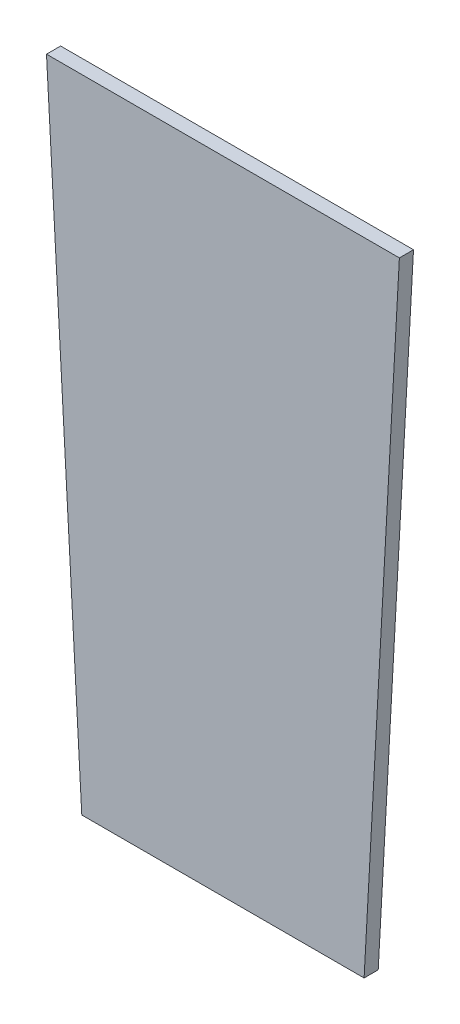
ISO-10303-21;
HEADER;
FILE_DESCRIPTION(('STEP AP214'),'2;1');
FILE_NAME('part.step','',(''),(''),'','','');
FILE_SCHEMA(('AUTOMOTIVE_DESIGN { 1 0 10303 214 1 1 1 1 }'));
ENDSEC;
DATA;
#1=APPLICATION_CONTEXT('core data for automotive mechanical design processes');
#2=APPLICATION_PROTOCOL_DEFINITION('international standard','automotive_design',2000,#1);
#3=PRODUCT_CONTEXT('',#1,'mechanical');
#4=PRODUCT('Part','Part','',(#3));
#5=PRODUCT_RELATED_PRODUCT_CATEGORY('part','',(#4));
#6=PRODUCT_DEFINITION_FORMATION('','',#4);
#7=PRODUCT_DEFINITION_CONTEXT('part definition',#1,'design');
#8=PRODUCT_DEFINITION('design','',#6,#7);
#9=PRODUCT_DEFINITION_SHAPE('','',#8);
#10=(LENGTH_UNIT() NAMED_UNIT(*) SI_UNIT(.MILLI.,.METRE.));
#11=(NAMED_UNIT(*) PLANE_ANGLE_UNIT() SI_UNIT($,.RADIAN.));
#12=(NAMED_UNIT(*) SI_UNIT($,.STERADIAN.) SOLID_ANGLE_UNIT());
#13=UNCERTAINTY_MEASURE_WITH_UNIT(LENGTH_MEASURE(1.E-05),#10,'distance_accuracy_value','');
#14=(GEOMETRIC_REPRESENTATION_CONTEXT(3) GLOBAL_UNCERTAINTY_ASSIGNED_CONTEXT((#13)) GLOBAL_UNIT_ASSIGNED_CONTEXT((#10,
#11,#12)) REPRESENTATION_CONTEXT('',''));
#15=CARTESIAN_POINT('',(0.,0.,0.));
#16=DIRECTION('',(0.,0.,1.));
#17=DIRECTION('',(1.,0.,0.));
#18=AXIS2_PLACEMENT_3D('',#15,#16,#17);
#19=CARTESIAN_POINT('',(-100.,-204.72972972973,10.));
#20=DIRECTION('',(0.998489379481367,0.0549450549450549,0.));
#21=DIRECTION('',(-0.0549450549450549,0.998489379481367,0.));
#22=AXIS2_PLACEMENT_3D('',#19,#20,#21);
#23=PLANE('',#22);
#24=DIRECTION('',(0.0549450549450549,-0.998489379481367,0.));
#25=VECTOR('',#24,1.);
#26=CARTESIAN_POINT('',(-100.,-204.72972972973,0.));
#27=LINE('',#26,#25);
#28=CARTESIAN_POINT('',(-125.,249.582937934292,0.));
#29=VERTEX_POINT('',#28);
#30=CARTESIAN_POINT('',(-100.,-204.72972972973,0.));
#31=VERTEX_POINT('',#30);
#32=EDGE_CURVE('E123',#29,#31,#27,.T.);
#33=ORIENTED_EDGE('',*,*,#32,.T.);
#34=DIRECTION('',(0.,0.,-1.));
#35=VECTOR('',#34,1.);
#36=CARTESIAN_POINT('',(-100.,-204.72972972973,10.));
#37=LINE('',#36,#35);
#38=CARTESIAN_POINT('',(-100.,-204.72972972973,10.));
#39=VERTEX_POINT('',#38);
#40=EDGE_CURVE('E11',#39,#31,#37,.T.);
#41=ORIENTED_EDGE('',*,*,#40,.F.);
#42=DIRECTION('',(0.0549450549450549,-0.998489379481367,0.));
#43=VECTOR('',#42,1.);
#44=CARTESIAN_POINT('',(-100.,-204.72972972973,10.));
#45=LINE('',#44,#43);
#46=CARTESIAN_POINT('',(-125.,249.582937934292,10.));
#47=VERTEX_POINT('',#46);
#48=EDGE_CURVE('E107',#47,#39,#45,.T.);
#49=ORIENTED_EDGE('',*,*,#48,.F.);
#50=DIRECTION('',(0.,0.,-1.));
#51=VECTOR('',#50,1.);
#52=CARTESIAN_POINT('',(-125.,249.582937934292,10.));
#53=LINE('',#52,#51);
#54=EDGE_CURVE('E119',#47,#29,#53,.T.);
#55=ORIENTED_EDGE('',*,*,#54,.T.);
#56=EDGE_LOOP('',(#33,#41,#49,#55));
#57=FACE_BOUND('',#56,.T.);
#58=ADVANCED_FACE('F49',(#57),#23,.F.);
#59=CARTESIAN_POINT('',(100.,-204.72972972973,10.));
#60=DIRECTION('',(0.,1.,0.));
#61=DIRECTION('',(0.,0.,1.));
#62=AXIS2_PLACEMENT_3D('',#59,#60,#61);
#63=PLANE('',#62);
#64=DIRECTION('',(1.,0.,0.));
#65=VECTOR('',#64,1.);
#66=CARTESIAN_POINT('',(100.,-204.72972972973,0.));
#67=LINE('',#66,#65);
#68=CARTESIAN_POINT('',(100.,-204.72972972973,0.));
#69=VERTEX_POINT('',#68);
#70=EDGE_CURVE('E112',#31,#69,#67,.T.);
#71=ORIENTED_EDGE('',*,*,#70,.T.);
#72=DIRECTION('',(0.,0.,-1.));
#73=VECTOR('',#72,1.);
#74=CARTESIAN_POINT('',(100.,-204.72972972973,10.));
#75=LINE('',#74,#73);
#76=CARTESIAN_POINT('',(100.,-204.72972972973,10.));
#77=VERTEX_POINT('',#76);
#78=EDGE_CURVE('E58',#77,#69,#75,.T.);
#79=ORIENTED_EDGE('',*,*,#78,.F.);
#80=DIRECTION('',(1.,0.,0.));
#81=VECTOR('',#80,1.);
#82=CARTESIAN_POINT('',(100.,-204.72972972973,10.));
#83=LINE('',#82,#81);
#84=EDGE_CURVE('E101',#39,#77,#83,.T.);
#85=ORIENTED_EDGE('',*,*,#84,.F.);
#86=ORIENTED_EDGE('',*,*,#40,.T.);
#87=EDGE_LOOP('',(#71,#79,#85,#86));
#88=FACE_BOUND('',#87,.T.);
#89=ADVANCED_FACE('F111',(#88),#63,.F.);
#90=CARTESIAN_POINT('',(125.,249.582937934292,10.));
#91=DIRECTION('',(-0.998489379481367,0.0549450549450549,0.));
#92=DIRECTION('',(-0.0549450549450549,-0.998489379481367,0.));
#93=AXIS2_PLACEMENT_3D('',#90,#91,#92);
#94=PLANE('',#93);
#95=DIRECTION('',(0.0549450549450549,0.998489379481367,0.));
#96=VECTOR('',#95,1.);
#97=CARTESIAN_POINT('',(125.,249.582937934292,0.));
#98=LINE('',#97,#96);
#99=CARTESIAN_POINT('',(125.,249.582937934292,0.));
#100=VERTEX_POINT('',#99);
#101=EDGE_CURVE('E88',#69,#100,#98,.T.);
#102=ORIENTED_EDGE('',*,*,#101,.T.);
#103=DIRECTION('',(0.,0.,-1.));
#104=VECTOR('',#103,1.);
#105=CARTESIAN_POINT('',(125.,249.582937934292,10.));
#106=LINE('',#105,#104);
#107=CARTESIAN_POINT('',(125.,249.582937934292,10.));
#108=VERTEX_POINT('',#107);
#109=EDGE_CURVE('E114',#108,#100,#106,.T.);
#110=ORIENTED_EDGE('',*,*,#109,.F.);
#111=DIRECTION('',(0.0549450549450549,0.998489379481367,0.));
#112=VECTOR('',#111,1.);
#113=CARTESIAN_POINT('',(125.,249.582937934292,10.));
#114=LINE('',#113,#112);
#115=EDGE_CURVE('E105',#77,#108,#114,.T.);
#116=ORIENTED_EDGE('',*,*,#115,.F.);
#117=ORIENTED_EDGE('',*,*,#78,.T.);
#118=EDGE_LOOP('',(#102,#110,#116,#117));
#119=FACE_BOUND('',#118,.T.);
#120=ADVANCED_FACE('F115',(#119),#94,.F.);
#121=CARTESIAN_POINT('',(-125.,249.582937934292,10.));
#122=DIRECTION('',(0.,-1.,0.));
#123=DIRECTION('',(0.,0.,-1.));
#124=AXIS2_PLACEMENT_3D('',#121,#122,#123);
#125=PLANE('',#124);
#126=DIRECTION('',(-1.,0.,0.));
#127=VECTOR('',#126,1.);
#128=CARTESIAN_POINT('',(-125.,249.582937934292,0.));
#129=LINE('',#128,#127);
#130=EDGE_CURVE('E94',#100,#29,#129,.T.);
#131=ORIENTED_EDGE('',*,*,#130,.T.);
#132=ORIENTED_EDGE('',*,*,#54,.F.);
#133=DIRECTION('',(-1.,0.,0.));
#134=VECTOR('',#133,1.);
#135=CARTESIAN_POINT('',(-125.,249.582937934292,10.));
#136=LINE('',#135,#134);
#137=EDGE_CURVE('E66',#108,#47,#136,.T.);
#138=ORIENTED_EDGE('',*,*,#137,.F.);
#139=ORIENTED_EDGE('',*,*,#109,.T.);
#140=EDGE_LOOP('',(#131,#132,#138,#139));
#141=FACE_BOUND('',#140,.T.);
#142=ADVANCED_FACE('F136',(#141),#125,.F.);
#143=CARTESIAN_POINT('',(0.,0.,10.));
#144=DIRECTION('',(0.,0.,-1.));
#145=DIRECTION('',(-1.,0.,0.));
#146=AXIS2_PLACEMENT_3D('',#143,#144,#145);
#147=PLANE('',#146);
#148=ORIENTED_EDGE('',*,*,#48,.T.);
#149=ORIENTED_EDGE('',*,*,#84,.T.);
#150=ORIENTED_EDGE('',*,*,#115,.T.);
#151=ORIENTED_EDGE('',*,*,#137,.T.);
#152=EDGE_LOOP('',(#148,#149,#150,#151));
#153=FACE_BOUND('',#152,.T.);
#154=ADVANCED_FACE('F103',(#153),#147,.F.);
#155=CARTESIAN_POINT('',(0.,0.,0.));
#156=DIRECTION('',(0.,0.,-1.));
#157=DIRECTION('',(-1.,0.,0.));
#158=AXIS2_PLACEMENT_3D('',#155,#156,#157);
#159=PLANE('',#158);
#160=ORIENTED_EDGE('',*,*,#32,.F.);
#161=ORIENTED_EDGE('',*,*,#130,.F.);
#162=ORIENTED_EDGE('',*,*,#101,.F.);
#163=ORIENTED_EDGE('',*,*,#70,.F.);
#164=EDGE_LOOP('',(#160,#161,#162,#163));
#165=FACE_BOUND('',#164,.T.);
#166=ADVANCED_FACE('F139',(#165),#159,.T.);
#167=CLOSED_SHELL('',(#58,#89,#120,#142,#154,#166));
#168=MANIFOLD_SOLID_BREP('B2',#167);
#169=ADVANCED_BREP_SHAPE_REPRESENTATION('',(#18,#168),#14);
#170=SHAPE_DEFINITION_REPRESENTATION(#9,#169);
ENDSEC;
END-ISO-10303-21;
